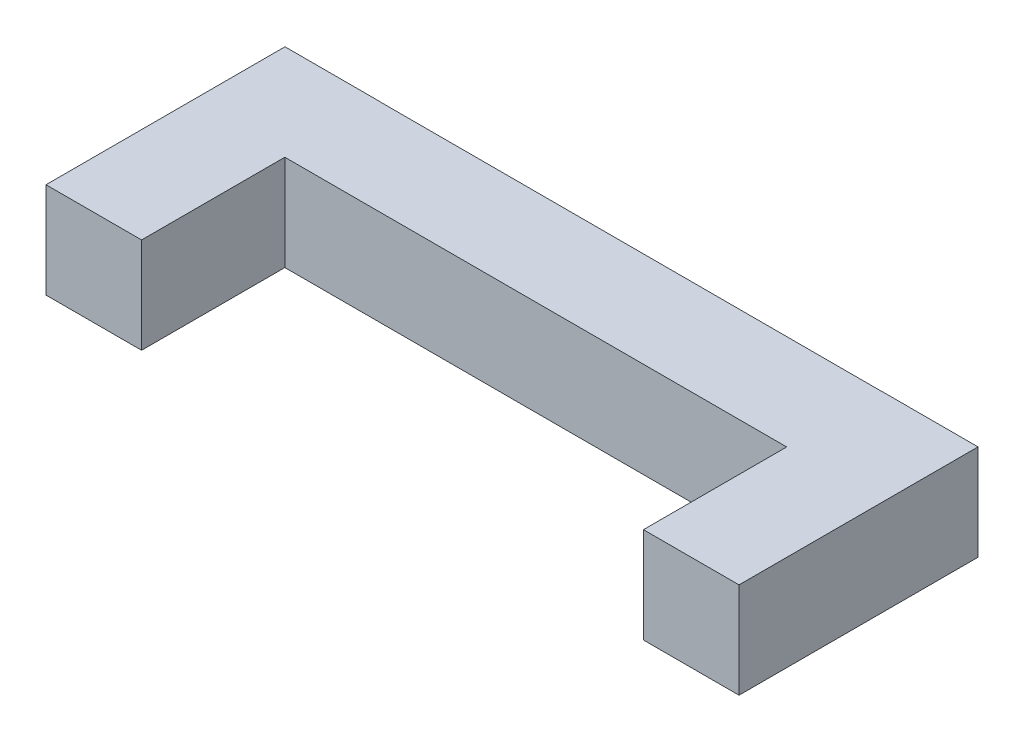
ISO-10303-21;
HEADER;
FILE_DESCRIPTION(('STEP AP214'),'2;1');
FILE_NAME('part.step','',(''),(''),'','','');
FILE_SCHEMA(('AUTOMOTIVE_DESIGN { 1 0 10303 214 1 1 1 1 }'));
ENDSEC;
DATA;
#1=APPLICATION_CONTEXT('core data for automotive mechanical design processes');
#2=APPLICATION_PROTOCOL_DEFINITION('international standard','automotive_design',2000,#1);
#3=PRODUCT_CONTEXT('',#1,'mechanical');
#4=PRODUCT('Part','Part','',(#3));
#5=PRODUCT_RELATED_PRODUCT_CATEGORY('part','',(#4));
#6=PRODUCT_DEFINITION_FORMATION('','',#4);
#7=PRODUCT_DEFINITION_CONTEXT('part definition',#1,'design');
#8=PRODUCT_DEFINITION('design','',#6,#7);
#9=PRODUCT_DEFINITION_SHAPE('','',#8);
#10=(LENGTH_UNIT() NAMED_UNIT(*) SI_UNIT(.MILLI.,.METRE.));
#11=(NAMED_UNIT(*) PLANE_ANGLE_UNIT() SI_UNIT($,.RADIAN.));
#12=(NAMED_UNIT(*) SI_UNIT($,.STERADIAN.) SOLID_ANGLE_UNIT());
#13=UNCERTAINTY_MEASURE_WITH_UNIT(LENGTH_MEASURE(1.E-05),#10,'distance_accuracy_value','');
#14=(GEOMETRIC_REPRESENTATION_CONTEXT(3) GLOBAL_UNCERTAINTY_ASSIGNED_CONTEXT((#13)) GLOBAL_UNIT_ASSIGNED_CONTEXT((#10,
#11,#12)) REPRESENTATION_CONTEXT('',''));
#15=CARTESIAN_POINT('',(0.,0.,0.));
#16=DIRECTION('',(0.,0.,1.));
#17=DIRECTION('',(1.,0.,0.));
#18=AXIS2_PLACEMENT_3D('',#15,#16,#17);
#19=CARTESIAN_POINT('',(0.,0.,-35.6));
#20=DIRECTION('',(0.,0.,-1.));
#21=DIRECTION('',(-1.,0.,0.));
#22=AXIS2_PLACEMENT_3D('',#19,#20,#21);
#23=PLANE('',#22);
#24=DIRECTION('',(-1.,0.,0.));
#25=VECTOR('',#24,1.);
#26=CARTESIAN_POINT('',(7.15964794267165,36.9181021954412,-35.6));
#27=LINE('',#26,#25);
#28=CARTESIAN_POINT('',(7.15964794267165,36.9181021954412,-35.6));
#29=VERTEX_POINT('',#28);
#30=CARTESIAN_POINT('',(5.15964794267165,36.9181021954412,-35.6));
#31=VERTEX_POINT('',#30);
#32=EDGE_CURVE('E182',#29,#31,#27,.T.);
#33=ORIENTED_EDGE('',*,*,#32,.F.);
#34=DIRECTION('',(0.,-1.,0.));
#35=VECTOR('',#34,1.);
#36=CARTESIAN_POINT('',(7.15964794267165,38.9181021954412,-35.6));
#37=LINE('',#36,#35);
#38=CARTESIAN_POINT('',(7.15964794267165,38.9181021954412,-35.6));
#39=VERTEX_POINT('',#38);
#40=EDGE_CURVE('E192',#39,#29,#37,.T.);
#41=ORIENTED_EDGE('',*,*,#40,.F.);
#42=DIRECTION('',(1.,0.,0.));
#43=VECTOR('',#42,1.);
#44=CARTESIAN_POINT('',(7.15964794267165,38.9181021954412,-35.6));
#45=LINE('',#44,#43);
#46=CARTESIAN_POINT('',(5.15964794267165,38.9181021954412,-35.6));
#47=VERTEX_POINT('',#46);
#48=EDGE_CURVE('E190',#47,#39,#45,.T.);
#49=ORIENTED_EDGE('',*,*,#48,.F.);
#50=DIRECTION('',(0.,1.,0.));
#51=VECTOR('',#50,1.);
#52=CARTESIAN_POINT('',(5.15964794267165,38.9181021954412,-35.6));
#53=LINE('',#52,#51);
#54=EDGE_CURVE('E177',#31,#47,#53,.T.);
#55=ORIENTED_EDGE('',*,*,#54,.F.);
#56=EDGE_LOOP('',(#33,#41,#49,#55));
#57=FACE_BOUND('',#56,.T.);
#58=ADVANCED_FACE('F36',(#57),#23,.F.);
#59=DIRECTION('',(-1.,0.,0.));
#60=VECTOR('',#59,1.);
#61=CARTESIAN_POINT('',(-5.34035205732835,36.9181021954412,-35.6));
#62=LINE('',#61,#60);
#63=CARTESIAN_POINT('',(-5.34035205732835,36.9181021954412,-35.6));
#64=VERTEX_POINT('',#63);
#65=CARTESIAN_POINT('',(-7.34035205732835,36.9181021954412,-35.6));
#66=VERTEX_POINT('',#65);
#67=EDGE_CURVE('E144',#64,#66,#62,.T.);
#68=ORIENTED_EDGE('',*,*,#67,.F.);
#69=DIRECTION('',(0.,-1.,0.));
#70=VECTOR('',#69,1.);
#71=CARTESIAN_POINT('',(-5.34035205732835,38.9181021954412,-35.6));
#72=LINE('',#71,#70);
#73=CARTESIAN_POINT('',(-5.34035205732835,38.9181021954412,-35.6));
#74=VERTEX_POINT('',#73);
#75=EDGE_CURVE('E147',#74,#64,#72,.T.);
#76=ORIENTED_EDGE('',*,*,#75,.F.);
#77=DIRECTION('',(1.,0.,0.));
#78=VECTOR('',#77,1.);
#79=CARTESIAN_POINT('',(-5.34035205732835,38.9181021954412,-35.6));
#80=LINE('',#79,#78);
#81=CARTESIAN_POINT('',(-7.34035205732835,38.9181021954412,-35.6));
#82=VERTEX_POINT('',#81);
#83=EDGE_CURVE('E57',#82,#74,#80,.T.);
#84=ORIENTED_EDGE('',*,*,#83,.F.);
#85=DIRECTION('',(0.,1.,0.));
#86=VECTOR('',#85,1.);
#87=CARTESIAN_POINT('',(-7.34035205732835,38.9181021954412,-35.6));
#88=LINE('',#87,#86);
#89=EDGE_CURVE('E50',#66,#82,#88,.T.);
#90=ORIENTED_EDGE('',*,*,#89,.F.);
#91=EDGE_LOOP('',(#68,#76,#84,#90));
#92=FACE_BOUND('',#91,.T.);
#93=ADVANCED_FACE('F247',(#92),#23,.F.);
#94=CARTESIAN_POINT('',(-7.34035205732835,38.9181021954412,-38.5973512446351));
#95=DIRECTION('',(0.,0.,-1.));
#96=DIRECTION('',(-1.,0.,0.));
#97=AXIS2_PLACEMENT_3D('',#94,#95,#96);
#98=PLANE('',#97);
#99=DIRECTION('',(0.,1.,0.));
#100=VECTOR('',#99,1.);
#101=CARTESIAN_POINT('',(-5.34035205732835,38.9181021954412,-38.5973512446351));
#102=LINE('',#101,#100);
#103=CARTESIAN_POINT('',(-5.34035205732835,36.9181021954412,-38.5973512446351));
#104=VERTEX_POINT('',#103);
#105=CARTESIAN_POINT('',(-5.34035205732835,38.9181021954412,-38.5973512446351));
#106=VERTEX_POINT('',#105);
#107=EDGE_CURVE('E160',#104,#106,#102,.T.);
#108=ORIENTED_EDGE('',*,*,#107,.F.);
#109=DIRECTION('',(1.,0.,0.));
#110=VECTOR('',#109,1.);
#111=CARTESIAN_POINT('',(-7.34035205732835,36.9181021954412,-38.5973512446351));
#112=LINE('',#111,#110);
#113=CARTESIAN_POINT('',(5.15964794267165,36.9181021954412,-38.5973512446351));
#114=VERTEX_POINT('',#113);
#115=EDGE_CURVE('E165',#104,#114,#112,.T.);
#116=ORIENTED_EDGE('',*,*,#115,.T.);
#117=DIRECTION('',(0.,1.,0.));
#118=VECTOR('',#117,1.);
#119=CARTESIAN_POINT('',(5.15964794267165,38.9181021954412,-38.5973512446351));
#120=LINE('',#119,#118);
#121=CARTESIAN_POINT('',(5.15964794267165,38.9181021954412,-38.5973512446351));
#122=VERTEX_POINT('',#121);
#123=EDGE_CURVE('E162',#114,#122,#120,.T.);
#124=ORIENTED_EDGE('',*,*,#123,.T.);
#125=DIRECTION('',(1.,0.,0.));
#126=VECTOR('',#125,1.);
#127=CARTESIAN_POINT('',(-7.34035205732835,38.9181021954412,-38.5973512446351));
#128=LINE('',#127,#126);
#129=EDGE_CURVE('E175',#106,#122,#128,.T.);
#130=ORIENTED_EDGE('',*,*,#129,.F.);
#131=EDGE_LOOP('',(#108,#116,#124,#130));
#132=FACE_BOUND('',#131,.T.);
#133=ADVANCED_FACE('F218',(#132),#98,.F.);
#134=CARTESIAN_POINT('',(-7.34035205732835,38.9181021954412,-40.5973512446351));
#135=DIRECTION('',(0.,0.,1.));
#136=DIRECTION('',(1.,0.,0.));
#137=AXIS2_PLACEMENT_3D('',#134,#135,#136);
#138=PLANE('',#137);
#139=DIRECTION('',(0.,-1.,0.));
#140=VECTOR('',#139,1.);
#141=CARTESIAN_POINT('',(-5.34035205732835,38.9181021954412,-40.5973512446351));
#142=LINE('',#141,#140);
#143=CARTESIAN_POINT('',(-5.34035205732835,38.9181021954412,-40.5973512446351));
#144=VERTEX_POINT('',#143);
#145=CARTESIAN_POINT('',(-5.34035205732835,36.9181021954412,-40.5973512446351));
#146=VERTEX_POINT('',#145);
#147=EDGE_CURVE('E12',#144,#146,#142,.T.);
#148=ORIENTED_EDGE('',*,*,#147,.F.);
#149=DIRECTION('',(1.,0.,0.));
#150=VECTOR('',#149,1.);
#151=CARTESIAN_POINT('',(-7.34035205732835,38.9181021954412,-40.5973512446351));
#152=LINE('',#151,#150);
#153=CARTESIAN_POINT('',(5.15964794267165,38.9181021954412,-40.5973512446351));
#154=VERTEX_POINT('',#153);
#155=EDGE_CURVE('E173',#144,#154,#152,.T.);
#156=ORIENTED_EDGE('',*,*,#155,.T.);
#157=DIRECTION('',(0.,-1.,0.));
#158=VECTOR('',#157,1.);
#159=CARTESIAN_POINT('',(5.15964794267165,38.9181021954412,-40.5973512446351));
#160=LINE('',#159,#158);
#161=CARTESIAN_POINT('',(5.15964794267165,36.9181021954412,-40.5973512446351));
#162=VERTEX_POINT('',#161);
#163=EDGE_CURVE('E129',#154,#162,#160,.T.);
#164=ORIENTED_EDGE('',*,*,#163,.T.);
#165=DIRECTION('',(1.,0.,0.));
#166=VECTOR('',#165,1.);
#167=CARTESIAN_POINT('',(-7.34035205732835,36.9181021954412,-40.5973512446351));
#168=LINE('',#167,#166);
#169=EDGE_CURVE('E171',#146,#162,#168,.T.);
#170=ORIENTED_EDGE('',*,*,#169,.F.);
#171=EDGE_LOOP('',(#148,#156,#164,#170));
#172=FACE_BOUND('',#171,.T.);
#173=ADVANCED_FACE('F241',(#172),#138,.F.);
#174=CARTESIAN_POINT('',(5.15964794267165,38.9181021954412,-40.6));
#175=DIRECTION('',(1.,0.,0.));
#176=DIRECTION('',(0.,0.,-1.));
#177=AXIS2_PLACEMENT_3D('',#174,#175,#176);
#178=PLANE('',#177);
#179=ORIENTED_EDGE('',*,*,#123,.F.);
#180=DIRECTION('',(0.,0.,1.));
#181=VECTOR('',#180,1.);
#182=CARTESIAN_POINT('',(5.15964794267165,36.9181021954412,-40.6));
#183=LINE('',#182,#181);
#184=EDGE_CURVE('E188',#114,#31,#183,.T.);
#185=ORIENTED_EDGE('',*,*,#184,.T.);
#186=ORIENTED_EDGE('',*,*,#54,.T.);
#187=DIRECTION('',(0.,0.,1.));
#188=VECTOR('',#187,1.);
#189=CARTESIAN_POINT('',(5.15964794267165,38.9181021954412,-40.6));
#190=LINE('',#189,#188);
#191=EDGE_CURVE('E204',#122,#47,#190,.T.);
#192=ORIENTED_EDGE('',*,*,#191,.F.);
#193=EDGE_LOOP('',(#179,#185,#186,#192));
#194=FACE_BOUND('',#193,.T.);
#195=ADVANCED_FACE('F214',(#194),#178,.F.);
#196=ORIENTED_EDGE('',*,*,#163,.F.);
#197=CARTESIAN_POINT('',(5.15964794267165,38.9181021954412,-40.6));
#198=VERTEX_POINT('',#197);
#199=EDGE_CURVE('E43',#198,#154,#190,.T.);
#200=ORIENTED_EDGE('',*,*,#199,.F.);
#201=DIRECTION('',(0.,1.,0.));
#202=VECTOR('',#201,1.);
#203=CARTESIAN_POINT('',(5.15964794267165,38.9181021954412,-40.6));
#204=LINE('',#203,#202);
#205=CARTESIAN_POINT('',(5.15964794267165,36.9181021954412,-40.6));
#206=VERTEX_POINT('',#205);
#207=EDGE_CURVE('E178',#206,#198,#204,.T.);
#208=ORIENTED_EDGE('',*,*,#207,.F.);
#209=EDGE_CURVE('E196',#206,#162,#183,.T.);
#210=ORIENTED_EDGE('',*,*,#209,.T.);
#211=EDGE_LOOP('',(#196,#200,#208,#210));
#212=FACE_BOUND('',#211,.T.);
#213=ADVANCED_FACE('F237',(#212),#178,.F.);
#214=CARTESIAN_POINT('',(7.15964794267165,38.9181021954412,-40.6));
#215=DIRECTION('',(0.,-1.,0.));
#216=DIRECTION('',(0.,0.,-1.));
#217=AXIS2_PLACEMENT_3D('',#214,#215,#216);
#218=PLANE('',#217);
#219=DIRECTION('',(0.,0.,-1.));
#220=VECTOR('',#219,1.);
#221=CARTESIAN_POINT('',(-7.34035205732835,38.9181021954412,-40.5973512446351));
#222=LINE('',#221,#220);
#223=CARTESIAN_POINT('',(-7.34035205732835,38.9181021954412,-40.6));
#224=VERTEX_POINT('',#223);
#225=EDGE_CURVE('E123',#82,#224,#222,.T.);
#226=ORIENTED_EDGE('',*,*,#225,.F.);
#227=ORIENTED_EDGE('',*,*,#83,.T.);
#228=DIRECTION('',(0.,0.,1.));
#229=VECTOR('',#228,1.);
#230=CARTESIAN_POINT('',(-5.34035205732835,38.9181021954412,-40.6));
#231=LINE('',#230,#229);
#232=EDGE_CURVE('E158',#106,#74,#231,.T.);
#233=ORIENTED_EDGE('',*,*,#232,.F.);
#234=ORIENTED_EDGE('',*,*,#129,.T.);
#235=ORIENTED_EDGE('',*,*,#191,.T.);
#236=ORIENTED_EDGE('',*,*,#48,.T.);
#237=DIRECTION('',(0.,0.,1.));
#238=VECTOR('',#237,1.);
#239=CARTESIAN_POINT('',(7.15964794267165,38.9181021954412,-40.6));
#240=LINE('',#239,#238);
#241=CARTESIAN_POINT('',(7.15964794267165,38.9181021954412,-40.6));
#242=VERTEX_POINT('',#241);
#243=EDGE_CURVE('E202',#242,#39,#240,.T.);
#244=ORIENTED_EDGE('',*,*,#243,.F.);
#245=DIRECTION('',(1.,0.,0.));
#246=VECTOR('',#245,1.);
#247=CARTESIAN_POINT('',(7.15964794267165,38.9181021954412,-40.6));
#248=LINE('',#247,#246);
#249=EDGE_CURVE('E181',#198,#242,#248,.T.);
#250=ORIENTED_EDGE('',*,*,#249,.F.);
#251=ORIENTED_EDGE('',*,*,#199,.T.);
#252=ORIENTED_EDGE('',*,*,#155,.F.);
#253=CARTESIAN_POINT('',(-5.34035205732835,38.9181021954412,-40.6));
#254=VERTEX_POINT('',#253);
#255=EDGE_CURVE('E135',#254,#144,#231,.T.);
#256=ORIENTED_EDGE('',*,*,#255,.F.);
#257=DIRECTION('',(1.,0.,0.));
#258=VECTOR('',#257,1.);
#259=CARTESIAN_POINT('',(-5.34035205732835,38.9181021954412,-40.6));
#260=LINE('',#259,#258);
#261=EDGE_CURVE('E132',#224,#254,#260,.T.);
#262=ORIENTED_EDGE('',*,*,#261,.F.);
#263=EDGE_LOOP('',(#226,#227,#233,#234,#235,#236,#244,#250,#251,#252,#256,#262));
#264=FACE_BOUND('',#263,.T.);
#265=ADVANCED_FACE('F133',(#264),#218,.F.);
#266=CARTESIAN_POINT('',(7.15964794267165,38.9181021954412,-40.6));
#267=DIRECTION('',(-1.,0.,0.));
#268=DIRECTION('',(0.,0.,1.));
#269=AXIS2_PLACEMENT_3D('',#266,#267,#268);
#270=PLANE('',#269);
#271=ORIENTED_EDGE('',*,*,#40,.T.);
#272=DIRECTION('',(0.,0.,1.));
#273=VECTOR('',#272,1.);
#274=CARTESIAN_POINT('',(7.15964794267165,36.9181021954412,-40.6));
#275=LINE('',#274,#273);
#276=CARTESIAN_POINT('',(7.15964794267165,36.9181021954412,-40.6));
#277=VERTEX_POINT('',#276);
#278=EDGE_CURVE('E199',#277,#29,#275,.T.);
#279=ORIENTED_EDGE('',*,*,#278,.F.);
#280=DIRECTION('',(0.,-1.,0.));
#281=VECTOR('',#280,1.);
#282=CARTESIAN_POINT('',(7.15964794267165,38.9181021954412,-40.6));
#283=LINE('',#282,#281);
#284=EDGE_CURVE('E184',#242,#277,#283,.T.);
#285=ORIENTED_EDGE('',*,*,#284,.F.);
#286=ORIENTED_EDGE('',*,*,#243,.T.);
#287=EDGE_LOOP('',(#271,#279,#285,#286));
#288=FACE_BOUND('',#287,.T.);
#289=ADVANCED_FACE('F230',(#288),#270,.F.);
#290=CARTESIAN_POINT('',(7.15964794267165,36.9181021954412,-40.6));
#291=DIRECTION('',(0.,1.,0.));
#292=DIRECTION('',(0.,0.,1.));
#293=AXIS2_PLACEMENT_3D('',#290,#291,#292);
#294=PLANE('',#293);
#295=DIRECTION('',(0.,0.,1.));
#296=VECTOR('',#295,1.);
#297=CARTESIAN_POINT('',(-7.34035205732835,36.9181021954412,-40.5973512446351));
#298=LINE('',#297,#296);
#299=CARTESIAN_POINT('',(-7.34035205732835,36.9181021954412,-40.6));
#300=VERTEX_POINT('',#299);
#301=EDGE_CURVE('E128',#300,#66,#298,.T.);
#302=ORIENTED_EDGE('',*,*,#301,.F.);
#303=DIRECTION('',(-1.,0.,0.));
#304=VECTOR('',#303,1.);
#305=CARTESIAN_POINT('',(-5.34035205732835,36.9181021954412,-40.6));
#306=LINE('',#305,#304);
#307=CARTESIAN_POINT('',(-5.34035205732835,36.9181021954412,-40.6));
#308=VERTEX_POINT('',#307);
#309=EDGE_CURVE('E143',#308,#300,#306,.T.);
#310=ORIENTED_EDGE('',*,*,#309,.F.);
#311=DIRECTION('',(0.,0.,1.));
#312=VECTOR('',#311,1.);
#313=CARTESIAN_POINT('',(-5.34035205732835,36.9181021954412,-40.6));
#314=LINE('',#313,#312);
#315=EDGE_CURVE('E156',#308,#146,#314,.T.);
#316=ORIENTED_EDGE('',*,*,#315,.T.);
#317=ORIENTED_EDGE('',*,*,#169,.T.);
#318=ORIENTED_EDGE('',*,*,#209,.F.);
#319=DIRECTION('',(-1.,0.,0.));
#320=VECTOR('',#319,1.);
#321=CARTESIAN_POINT('',(7.15964794267165,36.9181021954412,-40.6));
#322=LINE('',#321,#320);
#323=EDGE_CURVE('E186',#277,#206,#322,.T.);
#324=ORIENTED_EDGE('',*,*,#323,.F.);
#325=ORIENTED_EDGE('',*,*,#278,.T.);
#326=ORIENTED_EDGE('',*,*,#32,.T.);
#327=ORIENTED_EDGE('',*,*,#184,.F.);
#328=ORIENTED_EDGE('',*,*,#115,.F.);
#329=EDGE_CURVE('E152',#104,#64,#314,.T.);
#330=ORIENTED_EDGE('',*,*,#329,.T.);
#331=ORIENTED_EDGE('',*,*,#67,.T.);
#332=EDGE_LOOP('',(#302,#310,#316,#317,#318,#324,#325,#326,#327,#328,#330,#331));
#333=FACE_BOUND('',#332,.T.);
#334=ADVANCED_FACE('F223',(#333),#294,.F.);
#335=CARTESIAN_POINT('',(0.,0.,-40.6));
#336=DIRECTION('',(0.,0.,-1.));
#337=DIRECTION('',(-1.,0.,0.));
#338=AXIS2_PLACEMENT_3D('',#335,#336,#337);
#339=PLANE('',#338);
#340=ORIENTED_EDGE('',*,*,#207,.T.);
#341=ORIENTED_EDGE('',*,*,#249,.T.);
#342=ORIENTED_EDGE('',*,*,#284,.T.);
#343=ORIENTED_EDGE('',*,*,#323,.T.);
#344=EDGE_LOOP('',(#340,#341,#342,#343));
#345=FACE_BOUND('',#344,.T.);
#346=ADVANCED_FACE('F233',(#345),#339,.T.);
#347=CARTESIAN_POINT('',(-7.34035205732835,0.,0.));
#348=DIRECTION('',(-1.,0.,0.));
#349=DIRECTION('',(0.,0.,1.));
#350=AXIS2_PLACEMENT_3D('',#347,#348,#349);
#351=PLANE('',#350);
#352=ORIENTED_EDGE('',*,*,#301,.T.);
#353=ORIENTED_EDGE('',*,*,#89,.T.);
#354=ORIENTED_EDGE('',*,*,#225,.T.);
#355=DIRECTION('',(0.,1.,0.));
#356=VECTOR('',#355,1.);
#357=CARTESIAN_POINT('',(-7.34035205732835,38.9181021954412,-40.6));
#358=LINE('',#357,#356);
#359=EDGE_CURVE('E127',#300,#224,#358,.T.);
#360=ORIENTED_EDGE('',*,*,#359,.F.);
#361=EDGE_LOOP('',(#352,#353,#354,#360));
#362=FACE_BOUND('',#361,.T.);
#363=ADVANCED_FACE('F125',(#362),#351,.T.);
#364=CARTESIAN_POINT('',(0.,0.,-40.6));
#365=DIRECTION('',(0.,0.,-1.));
#366=DIRECTION('',(-1.,0.,0.));
#367=AXIS2_PLACEMENT_3D('',#364,#365,#366);
#368=PLANE('',#367);
#369=ORIENTED_EDGE('',*,*,#359,.T.);
#370=ORIENTED_EDGE('',*,*,#261,.T.);
#371=DIRECTION('',(0.,-1.,0.));
#372=VECTOR('',#371,1.);
#373=CARTESIAN_POINT('',(-5.34035205732835,38.9181021954412,-40.6));
#374=LINE('',#373,#372);
#375=EDGE_CURVE('E138',#254,#308,#374,.T.);
#376=ORIENTED_EDGE('',*,*,#375,.T.);
#377=ORIENTED_EDGE('',*,*,#309,.T.);
#378=EDGE_LOOP('',(#369,#370,#376,#377));
#379=FACE_BOUND('',#378,.T.);
#380=ADVANCED_FACE('F141',(#379),#368,.T.);
#381=CARTESIAN_POINT('',(-5.34035205732835,38.9181021954412,-40.6));
#382=DIRECTION('',(-1.,0.,0.));
#383=DIRECTION('',(0.,0.,1.));
#384=AXIS2_PLACEMENT_3D('',#381,#382,#383);
#385=PLANE('',#384);
#386=ORIENTED_EDGE('',*,*,#255,.T.);
#387=ORIENTED_EDGE('',*,*,#147,.T.);
#388=ORIENTED_EDGE('',*,*,#315,.F.);
#389=ORIENTED_EDGE('',*,*,#375,.F.);
#390=EDGE_LOOP('',(#386,#387,#388,#389));
#391=FACE_BOUND('',#390,.T.);
#392=ADVANCED_FACE('F244',(#391),#385,.F.);
#393=ORIENTED_EDGE('',*,*,#329,.F.);
#394=ORIENTED_EDGE('',*,*,#107,.T.);
#395=ORIENTED_EDGE('',*,*,#232,.T.);
#396=ORIENTED_EDGE('',*,*,#75,.T.);
#397=EDGE_LOOP('',(#393,#394,#395,#396));
#398=FACE_BOUND('',#397,.T.);
#399=ADVANCED_FACE('F250',(#398),#385,.F.);
#400=CLOSED_SHELL('',(#58,#93,#133,#173,#195,#213,#265,#289,#334,#346,#363,#380,#392,#399));
#401=MANIFOLD_SOLID_BREP('B2',#400);
#402=ADVANCED_BREP_SHAPE_REPRESENTATION('',(#18,#401),#14);
#403=SHAPE_DEFINITION_REPRESENTATION(#9,#402);
ENDSEC;
END-ISO-10303-21;
